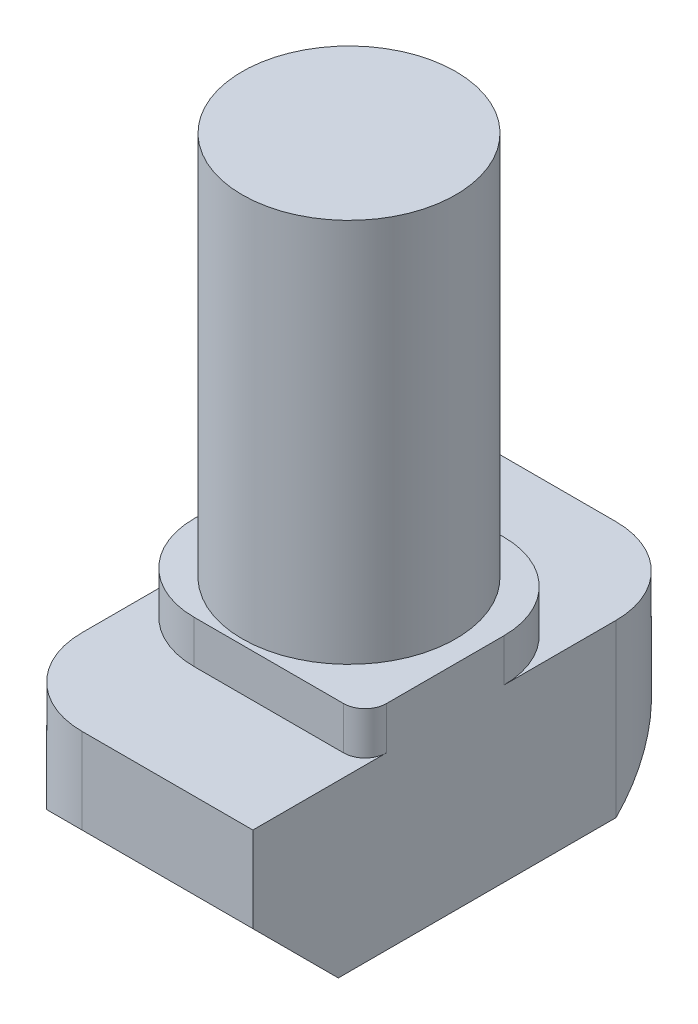
ISO-10303-21;
HEADER;
FILE_DESCRIPTION(('STEP AP214'),'2;1');
FILE_NAME('part.step','',(''),(''),'','','');
FILE_SCHEMA(('AUTOMOTIVE_DESIGN { 1 0 10303 214 1 1 1 1 }'));
ENDSEC;
DATA;
#1=APPLICATION_CONTEXT('core data for automotive mechanical design processes');
#2=APPLICATION_PROTOCOL_DEFINITION('international standard','automotive_design',2000,#1);
#3=PRODUCT_CONTEXT('',#1,'mechanical');
#4=PRODUCT('Part','Part','',(#3));
#5=PRODUCT_RELATED_PRODUCT_CATEGORY('part','',(#4));
#6=PRODUCT_DEFINITION_FORMATION('','',#4);
#7=PRODUCT_DEFINITION_CONTEXT('part definition',#1,'design');
#8=PRODUCT_DEFINITION('design','',#6,#7);
#9=PRODUCT_DEFINITION_SHAPE('','',#8);
#10=(LENGTH_UNIT() NAMED_UNIT(*) SI_UNIT(.MILLI.,.METRE.));
#11=(NAMED_UNIT(*) PLANE_ANGLE_UNIT() SI_UNIT($,.RADIAN.));
#12=(NAMED_UNIT(*) SI_UNIT($,.STERADIAN.) SOLID_ANGLE_UNIT());
#13=UNCERTAINTY_MEASURE_WITH_UNIT(LENGTH_MEASURE(1.E-05),#10,'distance_accuracy_value','');
#14=(GEOMETRIC_REPRESENTATION_CONTEXT(3) GLOBAL_UNCERTAINTY_ASSIGNED_CONTEXT((#13)) GLOBAL_UNIT_ASSIGNED_CONTEXT((#10,
#11,#12)) REPRESENTATION_CONTEXT('',''));
#15=CARTESIAN_POINT('',(0.,0.,0.));
#16=DIRECTION('',(0.,0.,1.));
#17=DIRECTION('',(1.,0.,0.));
#18=AXIS2_PLACEMENT_3D('',#15,#16,#17);
#19=CARTESIAN_POINT('',(3.,0.,2.625));
#20=DIRECTION('',(0.,-1.,0.));
#21=DIRECTION('',(0.,0.,-1.));
#22=AXIS2_PLACEMENT_3D('',#19,#20,#21);
#23=PLANE('',#22);
#24=DIRECTION('',(-1.,0.,0.));
#25=VECTOR('',#24,1.);
#26=CARTESIAN_POINT('',(3.,0.,-2.625));
#27=LINE('',#26,#25);
#28=CARTESIAN_POINT('',(1.,0.,-2.625));
#29=VERTEX_POINT('',#28);
#30=CARTESIAN_POINT('',(-2.5,0.,-2.625));
#31=VERTEX_POINT('',#30);
#32=EDGE_CURVE('E191',#29,#31,#27,.T.);
#33=ORIENTED_EDGE('',*,*,#32,.T.);
#34=CARTESIAN_POINT('',(-2.5,0.,-2.125));
#35=DIRECTION('',(0.,-1.,0.));
#36=DIRECTION('',(0.,0.,-1.));
#37=AXIS2_PLACEMENT_3D('',#34,#35,#36);
#38=CIRCLE('',#37,0.5);
#39=CARTESIAN_POINT('',(-3.,0.,-2.125));
#40=VERTEX_POINT('',#39);
#41=EDGE_CURVE('E252',#31,#40,#38,.F.);
#42=ORIENTED_EDGE('',*,*,#41,.T.);
#43=DIRECTION('',(0.,0.,1.));
#44=VECTOR('',#43,1.);
#45=CARTESIAN_POINT('',(-3.,0.,2.625));
#46=LINE('',#45,#44);
#47=CARTESIAN_POINT('',(-3.,0.,0.625000000000001));
#48=VERTEX_POINT('',#47);
#49=EDGE_CURVE('E146',#40,#48,#46,.T.);
#50=ORIENTED_EDGE('',*,*,#49,.T.);
#51=CARTESIAN_POINT('',(-1.,0.,0.625));
#52=DIRECTION('',(0.,-1.,0.));
#53=DIRECTION('',(0.,0.,-1.));
#54=AXIS2_PLACEMENT_3D('',#51,#52,#53);
#55=CIRCLE('',#54,2.);
#56=CARTESIAN_POINT('',(-1.,0.,2.625));
#57=VERTEX_POINT('',#56);
#58=EDGE_CURVE('E228',#48,#57,#55,.F.);
#59=ORIENTED_EDGE('',*,*,#58,.T.);
#60=DIRECTION('',(-1.,0.,0.));
#61=VECTOR('',#60,1.);
#62=CARTESIAN_POINT('',(3.,0.,2.625));
#63=LINE('',#62,#61);
#64=CARTESIAN_POINT('',(2.5,0.,2.625));
#65=VERTEX_POINT('',#64);
#66=EDGE_CURVE('E175',#65,#57,#63,.T.);
#67=ORIENTED_EDGE('',*,*,#66,.F.);
#68=CARTESIAN_POINT('',(2.5,0.,2.125));
#69=DIRECTION('',(0.,-1.,0.));
#70=DIRECTION('',(0.,0.,-1.));
#71=AXIS2_PLACEMENT_3D('',#68,#69,#70);
#72=CIRCLE('',#71,0.5);
#73=CARTESIAN_POINT('',(3.,0.,2.125));
#74=VERTEX_POINT('',#73);
#75=EDGE_CURVE('E250',#65,#74,#72,.F.);
#76=ORIENTED_EDGE('',*,*,#75,.T.);
#77=DIRECTION('',(0.,0.,1.));
#78=VECTOR('',#77,1.);
#79=CARTESIAN_POINT('',(3.,0.,2.625));
#80=LINE('',#79,#78);
#81=CARTESIAN_POINT('',(3.,0.,-0.624999999999999));
#82=VERTEX_POINT('',#81);
#83=EDGE_CURVE('E173',#82,#74,#80,.T.);
#84=ORIENTED_EDGE('',*,*,#83,.F.);
#85=CARTESIAN_POINT('',(1.,0.,-0.625));
#86=DIRECTION('',(0.,-1.,0.));
#87=DIRECTION('',(0.,0.,-1.));
#88=AXIS2_PLACEMENT_3D('',#85,#86,#87);
#89=CIRCLE('',#88,2.);
#90=EDGE_CURVE('E231',#82,#29,#89,.F.);
#91=ORIENTED_EDGE('',*,*,#90,.T.);
#92=EDGE_LOOP('',(#33,#42,#50,#59,#67,#76,#84,#91));
#93=FACE_BOUND('',#92,.T.);
#94=CARTESIAN_POINT('',(0.,0.,0.));
#95=DIRECTION('',(0.,-1.,0.));
#96=DIRECTION('',(0.,0.,-1.));
#97=AXIS2_PLACEMENT_3D('',#94,#95,#96);
#98=CIRCLE('',#97,2.5);
#99=CARTESIAN_POINT('',(0.,0.,-2.5));
#100=VERTEX_POINT('',#99);
#101=EDGE_CURVE('E11',#100,#100,#98,.F.);
#102=ORIENTED_EDGE('',*,*,#101,.F.);
#103=EDGE_LOOP('',(#102));
#104=FACE_BOUND('',#103,.T.);
#105=ADVANCED_FACE('F36',(#93,#104),#23,.F.);
#106=CARTESIAN_POINT('',(3.,-1.,2.625));
#107=DIRECTION('',(0.,0.,-1.));
#108=DIRECTION('',(-1.,0.,0.));
#109=AXIS2_PLACEMENT_3D('',#106,#107,#108);
#110=PLANE('',#109);
#111=DIRECTION('',(-1.,0.,0.));
#112=VECTOR('',#111,1.);
#113=CARTESIAN_POINT('',(3.,-1.,2.625));
#114=LINE('',#113,#112);
#115=CARTESIAN_POINT('',(2.5,-1.,2.625));
#116=VERTEX_POINT('',#115);
#117=CARTESIAN_POINT('',(-1.,-1.,2.625));
#118=VERTEX_POINT('',#117);
#119=EDGE_CURVE('E157',#116,#118,#114,.T.);
#120=ORIENTED_EDGE('',*,*,#119,.F.);
#121=DIRECTION('',(0.,-1.,0.));
#122=VECTOR('',#121,1.);
#123=CARTESIAN_POINT('',(2.5,-1.,2.625));
#124=LINE('',#123,#122);
#125=EDGE_CURVE('E258',#116,#65,#124,.F.);
#126=ORIENTED_EDGE('',*,*,#125,.T.);
#127=ORIENTED_EDGE('',*,*,#66,.T.);
#128=DIRECTION('',(0.,-1.,0.));
#129=VECTOR('',#128,1.);
#130=CARTESIAN_POINT('',(-1.,-1.,2.625));
#131=LINE('',#130,#129);
#132=EDGE_CURVE('E235',#57,#118,#131,.T.);
#133=ORIENTED_EDGE('',*,*,#132,.T.);
#134=EDGE_LOOP('',(#120,#126,#127,#133));
#135=FACE_BOUND('',#134,.T.);
#136=ADVANCED_FACE('F293',(#135),#110,.F.);
#137=CARTESIAN_POINT('',(3.,-1.,5.25));
#138=DIRECTION('',(0.,-1.,0.));
#139=DIRECTION('',(0.,0.,-1.));
#140=AXIS2_PLACEMENT_3D('',#137,#138,#139);
#141=PLANE('',#140);
#142=DIRECTION('',(0.,0.,1.));
#143=VECTOR('',#142,1.);
#144=CARTESIAN_POINT('',(-3.,-1.,5.25));
#145=LINE('',#144,#143);
#146=CARTESIAN_POINT('',(-3.,-1.,0.625));
#147=VERTEX_POINT('',#146);
#148=CARTESIAN_POINT('',(-3.,-1.,3.25));
#149=VERTEX_POINT('',#148);
#150=EDGE_CURVE('E176',#147,#149,#145,.T.);
#151=ORIENTED_EDGE('',*,*,#150,.T.);
#152=CARTESIAN_POINT('',(-1.,-1.,3.25));
#153=DIRECTION('',(0.,-1.,0.));
#154=DIRECTION('',(0.,0.,-1.));
#155=AXIS2_PLACEMENT_3D('',#152,#153,#154);
#156=CIRCLE('',#155,2.);
#157=CARTESIAN_POINT('',(-1.,-1.,5.25));
#158=VERTEX_POINT('',#157);
#159=EDGE_CURVE('E153',#149,#158,#156,.F.);
#160=ORIENTED_EDGE('',*,*,#159,.T.);
#161=DIRECTION('',(-1.,0.,0.));
#162=VECTOR('',#161,1.);
#163=CARTESIAN_POINT('',(3.,-1.,5.25));
#164=LINE('',#163,#162);
#165=CARTESIAN_POINT('',(3.,-1.,5.25));
#166=VERTEX_POINT('',#165);
#167=EDGE_CURVE('E149',#166,#158,#164,.T.);
#168=ORIENTED_EDGE('',*,*,#167,.F.);
#169=DIRECTION('',(0.,0.,1.));
#170=VECTOR('',#169,1.);
#171=CARTESIAN_POINT('',(3.,-1.,5.25));
#172=LINE('',#171,#170);
#173=CARTESIAN_POINT('',(3.,-1.,2.125));
#174=VERTEX_POINT('',#173);
#175=EDGE_CURVE('E55',#174,#166,#172,.T.);
#176=ORIENTED_EDGE('',*,*,#175,.F.);
#177=CARTESIAN_POINT('',(2.5,-1.,2.125));
#178=DIRECTION('',(0.,-1.,0.));
#179=DIRECTION('',(0.,0.,-1.));
#180=AXIS2_PLACEMENT_3D('',#177,#178,#179);
#181=CIRCLE('',#180,0.5);
#182=EDGE_CURVE('E44',#174,#116,#181,.T.);
#183=ORIENTED_EDGE('',*,*,#182,.T.);
#184=ORIENTED_EDGE('',*,*,#119,.T.);
#185=CARTESIAN_POINT('',(-1.,-1.,0.625));
#186=DIRECTION('',(0.,-1.,0.));
#187=DIRECTION('',(0.,0.,-1.));
#188=AXIS2_PLACEMENT_3D('',#185,#186,#187);
#189=CIRCLE('',#188,2.);
#190=EDGE_CURVE('E244',#118,#147,#189,.T.);
#191=ORIENTED_EDGE('',*,*,#190,.T.);
#192=EDGE_LOOP('',(#151,#160,#168,#176,#183,#184,#191));
#193=FACE_BOUND('',#192,.T.);
#194=ADVANCED_FACE('F151',(#193),#141,.F.);
#195=CARTESIAN_POINT('',(3.,-3.,5.25));
#196=DIRECTION('',(0.,0.,-1.));
#197=DIRECTION('',(-1.,0.,0.));
#198=AXIS2_PLACEMENT_3D('',#195,#196,#197);
#199=PLANE('',#198);
#200=ORIENTED_EDGE('',*,*,#167,.T.);
#201=DIRECTION('',(0.,-1.,0.));
#202=VECTOR('',#201,1.);
#203=CARTESIAN_POINT('',(-1.,-3.,5.25));
#204=LINE('',#203,#202);
#205=CARTESIAN_POINT('',(-1.,-3.,5.25));
#206=VERTEX_POINT('',#205);
#207=EDGE_CURVE('E218',#158,#206,#204,.T.);
#208=ORIENTED_EDGE('',*,*,#207,.T.);
#209=DIRECTION('',(-1.,0.,0.));
#210=VECTOR('',#209,1.);
#211=CARTESIAN_POINT('',(3.,-3.,5.25));
#212=LINE('',#211,#210);
#213=CARTESIAN_POINT('',(3.,-3.,5.25));
#214=VERTEX_POINT('',#213);
#215=EDGE_CURVE('E158',#214,#206,#212,.T.);
#216=ORIENTED_EDGE('',*,*,#215,.F.);
#217=DIRECTION('',(0.,-1.,0.));
#218=VECTOR('',#217,1.);
#219=CARTESIAN_POINT('',(3.,-3.,5.25));
#220=LINE('',#219,#218);
#221=EDGE_CURVE('E142',#166,#214,#220,.T.);
#222=ORIENTED_EDGE('',*,*,#221,.F.);
#223=EDGE_LOOP('',(#200,#208,#216,#222));
#224=FACE_BOUND('',#223,.T.);
#225=ADVANCED_FACE('F160',(#224),#199,.F.);
#226=CARTESIAN_POINT('',(3.,-5.,3.25));
#227=DIRECTION('',(0.,0.707106781186546,-0.707106781186549));
#228=DIRECTION('',(0.,0.707106781186549,0.707106781186546));
#229=AXIS2_PLACEMENT_3D('',#226,#227,#228);
#230=PLANE('',#229);
#231=ORIENTED_EDGE('',*,*,#215,.T.);
#232=CARTESIAN_POINT('',(-1.,-5.00000000000001,3.25));
#233=DIRECTION('',(0.,0.707106781186546,-0.707106781186549));
#234=DIRECTION('',(0.,0.707106781186549,0.707106781186546));
#235=AXIS2_PLACEMENT_3D('',#232,#233,#234);
#236=ELLIPSE('',#235,2.82842712474619,2.);
#237=CARTESIAN_POINT('',(-3.,-5.,3.25));
#238=VERTEX_POINT('',#237);
#239=EDGE_CURVE('E220',#206,#238,#236,.F.);
#240=ORIENTED_EDGE('',*,*,#239,.T.);
#241=DIRECTION('',(-1.,0.,0.));
#242=VECTOR('',#241,1.);
#243=CARTESIAN_POINT('',(3.,-5.,3.25));
#244=LINE('',#243,#242);
#245=CARTESIAN_POINT('',(3.,-5.,3.25));
#246=VERTEX_POINT('',#245);
#247=EDGE_CURVE('E204',#246,#238,#244,.T.);
#248=ORIENTED_EDGE('',*,*,#247,.F.);
#249=DIRECTION('',(0.,-0.707106781186549,-0.707106781186546));
#250=VECTOR('',#249,1.);
#251=CARTESIAN_POINT('',(3.,-5.,3.25));
#252=LINE('',#251,#250);
#253=EDGE_CURVE('E163',#214,#246,#252,.T.);
#254=ORIENTED_EDGE('',*,*,#253,.F.);
#255=EDGE_LOOP('',(#231,#240,#248,#254));
#256=FACE_BOUND('',#255,.T.);
#257=ADVANCED_FACE('F298',(#256),#230,.F.);
#258=CARTESIAN_POINT('',(3.,-5.,-3.24999999999999));
#259=DIRECTION('',(0.,1.,0.));
#260=DIRECTION('',(0.,0.,1.));
#261=AXIS2_PLACEMENT_3D('',#258,#259,#260);
#262=PLANE('',#261);
#263=DIRECTION('',(0.,0.,-1.));
#264=VECTOR('',#263,1.);
#265=CARTESIAN_POINT('',(-3.,-5.,-3.24999999999999));
#266=LINE('',#265,#264);
#267=CARTESIAN_POINT('',(-3.,-5.,-3.24999999999999));
#268=VERTEX_POINT('',#267);
#269=EDGE_CURVE('E178',#238,#268,#266,.T.);
#270=ORIENTED_EDGE('',*,*,#269,.T.);
#271=DIRECTION('',(-1.,0.,0.));
#272=VECTOR('',#271,1.);
#273=CARTESIAN_POINT('',(3.,-5.,-3.24999999999999));
#274=LINE('',#273,#272);
#275=CARTESIAN_POINT('',(3.,-5.,-3.24999999999999));
#276=VERTEX_POINT('',#275);
#277=EDGE_CURVE('E201',#276,#268,#274,.T.);
#278=ORIENTED_EDGE('',*,*,#277,.F.);
#279=DIRECTION('',(0.,0.,-1.));
#280=VECTOR('',#279,1.);
#281=CARTESIAN_POINT('',(3.,-5.,-3.24999999999999));
#282=LINE('',#281,#280);
#283=EDGE_CURVE('E165',#246,#276,#282,.T.);
#284=ORIENTED_EDGE('',*,*,#283,.F.);
#285=ORIENTED_EDGE('',*,*,#247,.T.);
#286=EDGE_LOOP('',(#270,#278,#284,#285));
#287=FACE_BOUND('',#286,.T.);
#288=ADVANCED_FACE('F304',(#287),#262,.F.);
#289=CARTESIAN_POINT('',(3.,-3.,-5.25));
#290=DIRECTION('',(0.,0.707106781186548,0.707106781186547));
#291=DIRECTION('',(0.,-0.707106781186547,0.707106781186548));
#292=AXIS2_PLACEMENT_3D('',#289,#290,#291);
#293=PLANE('',#292);
#294=DIRECTION('',(-1.,0.,0.));
#295=VECTOR('',#294,1.);
#296=CARTESIAN_POINT('',(3.,-3.,-5.25));
#297=LINE('',#296,#295);
#298=CARTESIAN_POINT('',(1.,-3.,-5.25));
#299=VERTEX_POINT('',#298);
#300=CARTESIAN_POINT('',(-3.,-3.,-5.25));
#301=VERTEX_POINT('',#300);
#302=EDGE_CURVE('E199',#299,#301,#297,.T.);
#303=ORIENTED_EDGE('',*,*,#302,.F.);
#304=CARTESIAN_POINT('',(1.,-4.99999999999999,-3.25));
#305=DIRECTION('',(0.,0.707106781186548,0.707106781186547));
#306=DIRECTION('',(0.,0.707106781186547,-0.707106781186548));
#307=AXIS2_PLACEMENT_3D('',#304,#305,#306);
#308=ELLIPSE('',#307,2.82842712474619,2.);
#309=EDGE_CURVE('E216',#299,#276,#308,.F.);
#310=ORIENTED_EDGE('',*,*,#309,.T.);
#311=ORIENTED_EDGE('',*,*,#277,.T.);
#312=DIRECTION('',(0.,0.707106781186547,-0.707106781186548));
#313=VECTOR('',#312,1.);
#314=CARTESIAN_POINT('',(-3.,-3.,-5.25));
#315=LINE('',#314,#313);
#316=EDGE_CURVE('E181',#268,#301,#315,.T.);
#317=ORIENTED_EDGE('',*,*,#316,.T.);
#318=EDGE_LOOP('',(#303,#310,#311,#317));
#319=FACE_BOUND('',#318,.T.);
#320=ADVANCED_FACE('F317',(#319),#293,.F.);
#321=CARTESIAN_POINT('',(3.,-1.,-5.25));
#322=DIRECTION('',(0.,0.,1.));
#323=DIRECTION('',(1.,0.,0.));
#324=AXIS2_PLACEMENT_3D('',#321,#322,#323);
#325=PLANE('',#324);
#326=DIRECTION('',(-1.,0.,0.));
#327=VECTOR('',#326,1.);
#328=CARTESIAN_POINT('',(3.,-1.,-5.25));
#329=LINE('',#328,#327);
#330=CARTESIAN_POINT('',(1.,-1.,-5.25));
#331=VERTEX_POINT('',#330);
#332=CARTESIAN_POINT('',(-3.,-1.,-5.25));
#333=VERTEX_POINT('',#332);
#334=EDGE_CURVE('E197',#331,#333,#329,.T.);
#335=ORIENTED_EDGE('',*,*,#334,.F.);
#336=DIRECTION('',(0.,1.,0.));
#337=VECTOR('',#336,1.);
#338=CARTESIAN_POINT('',(1.,-1.,-5.25));
#339=LINE('',#338,#337);
#340=EDGE_CURVE('E214',#331,#299,#339,.F.);
#341=ORIENTED_EDGE('',*,*,#340,.T.);
#342=ORIENTED_EDGE('',*,*,#302,.T.);
#343=DIRECTION('',(0.,1.,0.));
#344=VECTOR('',#343,1.);
#345=CARTESIAN_POINT('',(-3.,-1.,-5.25));
#346=LINE('',#345,#344);
#347=EDGE_CURVE('E184',#301,#333,#346,.T.);
#348=ORIENTED_EDGE('',*,*,#347,.T.);
#349=EDGE_LOOP('',(#335,#341,#342,#348));
#350=FACE_BOUND('',#349,.T.);
#351=ADVANCED_FACE('F314',(#350),#325,.F.);
#352=CARTESIAN_POINT('',(3.,-1.,-2.625));
#353=DIRECTION('',(0.,-1.,0.));
#354=DIRECTION('',(0.,0.,-1.));
#355=AXIS2_PLACEMENT_3D('',#352,#353,#354);
#356=PLANE('',#355);
#357=DIRECTION('',(0.,0.,1.));
#358=VECTOR('',#357,1.);
#359=CARTESIAN_POINT('',(3.,-1.,-2.625));
#360=LINE('',#359,#358);
#361=CARTESIAN_POINT('',(3.,-1.,-3.25));
#362=VERTEX_POINT('',#361);
#363=CARTESIAN_POINT('',(3.,-1.,-0.625));
#364=VERTEX_POINT('',#363);
#365=EDGE_CURVE('E171',#362,#364,#360,.T.);
#366=ORIENTED_EDGE('',*,*,#365,.F.);
#367=CARTESIAN_POINT('',(1.,-1.,-3.25));
#368=DIRECTION('',(0.,-1.,0.));
#369=DIRECTION('',(0.,0.,-1.));
#370=AXIS2_PLACEMENT_3D('',#367,#368,#369);
#371=CIRCLE('',#370,2.);
#372=EDGE_CURVE('E212',#362,#331,#371,.F.);
#373=ORIENTED_EDGE('',*,*,#372,.T.);
#374=ORIENTED_EDGE('',*,*,#334,.T.);
#375=DIRECTION('',(0.,0.,1.));
#376=VECTOR('',#375,1.);
#377=CARTESIAN_POINT('',(-3.,-1.,-2.625));
#378=LINE('',#377,#376);
#379=CARTESIAN_POINT('',(-3.,-1.,-2.125));
#380=VERTEX_POINT('',#379);
#381=EDGE_CURVE('E187',#333,#380,#378,.T.);
#382=ORIENTED_EDGE('',*,*,#381,.T.);
#383=CARTESIAN_POINT('',(-2.5,-1.,-2.125));
#384=DIRECTION('',(0.,-1.,0.));
#385=DIRECTION('',(0.,0.,-1.));
#386=AXIS2_PLACEMENT_3D('',#383,#384,#385);
#387=CIRCLE('',#386,0.5);
#388=CARTESIAN_POINT('',(-2.5,-1.,-2.625));
#389=VERTEX_POINT('',#388);
#390=EDGE_CURVE('E260',#380,#389,#387,.T.);
#391=ORIENTED_EDGE('',*,*,#390,.T.);
#392=DIRECTION('',(-1.,0.,0.));
#393=VECTOR('',#392,1.);
#394=CARTESIAN_POINT('',(3.,-1.,-2.625));
#395=LINE('',#394,#393);
#396=CARTESIAN_POINT('',(1.,-1.,-2.625));
#397=VERTEX_POINT('',#396);
#398=EDGE_CURVE('E194',#397,#389,#395,.T.);
#399=ORIENTED_EDGE('',*,*,#398,.F.);
#400=CARTESIAN_POINT('',(1.,-1.,-0.625));
#401=DIRECTION('',(0.,-1.,0.));
#402=DIRECTION('',(0.,0.,-1.));
#403=AXIS2_PLACEMENT_3D('',#400,#401,#402);
#404=CIRCLE('',#403,2.);
#405=EDGE_CURVE('E241',#397,#364,#404,.T.);
#406=ORIENTED_EDGE('',*,*,#405,.T.);
#407=EDGE_LOOP('',(#366,#373,#374,#382,#391,#399,#406));
#408=FACE_BOUND('',#407,.T.);
#409=ADVANCED_FACE('F265',(#408),#356,.F.);
#410=CARTESIAN_POINT('',(3.,0.,-2.625));
#411=DIRECTION('',(0.,0.,1.));
#412=DIRECTION('',(1.,0.,0.));
#413=AXIS2_PLACEMENT_3D('',#410,#411,#412);
#414=PLANE('',#413);
#415=ORIENTED_EDGE('',*,*,#398,.T.);
#416=DIRECTION('',(0.,1.,0.));
#417=VECTOR('',#416,1.);
#418=CARTESIAN_POINT('',(-2.5,0.,-2.625));
#419=LINE('',#418,#417);
#420=EDGE_CURVE('E247',#389,#31,#419,.T.);
#421=ORIENTED_EDGE('',*,*,#420,.T.);
#422=ORIENTED_EDGE('',*,*,#32,.F.);
#423=DIRECTION('',(0.,1.,0.));
#424=VECTOR('',#423,1.);
#425=CARTESIAN_POINT('',(1.,0.,-2.625));
#426=LINE('',#425,#424);
#427=EDGE_CURVE('E233',#29,#397,#426,.F.);
#428=ORIENTED_EDGE('',*,*,#427,.T.);
#429=EDGE_LOOP('',(#415,#421,#422,#428));
#430=FACE_BOUND('',#429,.T.);
#431=ADVANCED_FACE('F272',(#430),#414,.F.);
#432=CARTESIAN_POINT('',(3.,0.,0.));
#433=DIRECTION('',(-1.,0.,0.));
#434=DIRECTION('',(0.,0.,1.));
#435=AXIS2_PLACEMENT_3D('',#432,#433,#434);
#436=PLANE('',#435);
#437=ORIENTED_EDGE('',*,*,#83,.T.);
#438=DIRECTION('',(0.,-1.,0.));
#439=VECTOR('',#438,1.);
#440=CARTESIAN_POINT('',(3.,0.,2.125));
#441=LINE('',#440,#439);
#442=EDGE_CURVE('E145',#74,#174,#441,.T.);
#443=ORIENTED_EDGE('',*,*,#442,.T.);
#444=ORIENTED_EDGE('',*,*,#175,.T.);
#445=ORIENTED_EDGE('',*,*,#221,.T.);
#446=ORIENTED_EDGE('',*,*,#253,.T.);
#447=ORIENTED_EDGE('',*,*,#283,.T.);
#448=DIRECTION('',(0.,1.,0.));
#449=VECTOR('',#448,1.);
#450=CARTESIAN_POINT('',(3.,0.,-3.25));
#451=LINE('',#450,#449);
#452=EDGE_CURVE('E209',#276,#362,#451,.T.);
#453=ORIENTED_EDGE('',*,*,#452,.T.);
#454=ORIENTED_EDGE('',*,*,#365,.T.);
#455=DIRECTION('',(0.,1.,0.));
#456=VECTOR('',#455,1.);
#457=CARTESIAN_POINT('',(3.,0.,-0.625));
#458=LINE('',#457,#456);
#459=EDGE_CURVE('E225',#364,#82,#458,.T.);
#460=ORIENTED_EDGE('',*,*,#459,.T.);
#461=EDGE_LOOP('',(#437,#443,#444,#445,#446,#447,#453,#454,#460));
#462=FACE_BOUND('',#461,.T.);
#463=ADVANCED_FACE('F140',(#462),#436,.F.);
#464=CARTESIAN_POINT('',(-3.,0.,0.));
#465=DIRECTION('',(-1.,0.,0.));
#466=DIRECTION('',(0.,0.,1.));
#467=AXIS2_PLACEMENT_3D('',#464,#465,#466);
#468=PLANE('',#467);
#469=ORIENTED_EDGE('',*,*,#49,.F.);
#470=DIRECTION('',(0.,1.,0.));
#471=VECTOR('',#470,1.);
#472=CARTESIAN_POINT('',(-3.,-1.,-2.125));
#473=LINE('',#472,#471);
#474=EDGE_CURVE('E254',#40,#380,#473,.F.);
#475=ORIENTED_EDGE('',*,*,#474,.T.);
#476=ORIENTED_EDGE('',*,*,#381,.F.);
#477=ORIENTED_EDGE('',*,*,#347,.F.);
#478=ORIENTED_EDGE('',*,*,#316,.F.);
#479=ORIENTED_EDGE('',*,*,#269,.F.);
#480=DIRECTION('',(0.,-1.,0.));
#481=VECTOR('',#480,1.);
#482=CARTESIAN_POINT('',(-3.,-1.,3.25));
#483=LINE('',#482,#481);
#484=EDGE_CURVE('E222',#238,#149,#483,.F.);
#485=ORIENTED_EDGE('',*,*,#484,.T.);
#486=ORIENTED_EDGE('',*,*,#150,.F.);
#487=DIRECTION('',(0.,-1.,0.));
#488=VECTOR('',#487,1.);
#489=CARTESIAN_POINT('',(-3.,0.,0.625));
#490=LINE('',#489,#488);
#491=EDGE_CURVE('E238',#147,#48,#490,.F.);
#492=ORIENTED_EDGE('',*,*,#491,.T.);
#493=EDGE_LOOP('',(#469,#475,#476,#477,#478,#479,#485,#486,#492));
#494=FACE_BOUND('',#493,.T.);
#495=ADVANCED_FACE('F280',(#494),#468,.T.);
#496=CARTESIAN_POINT('',(1.,0.,-3.25));
#497=DIRECTION('',(0.,1.,0.));
#498=DIRECTION('',(0.,0.,1.));
#499=AXIS2_PLACEMENT_3D('',#496,#497,#498);
#500=CYLINDRICAL_SURFACE('',#499,2.);
#501=ORIENTED_EDGE('',*,*,#309,.F.);
#502=ORIENTED_EDGE('',*,*,#340,.F.);
#503=ORIENTED_EDGE('',*,*,#372,.F.);
#504=ORIENTED_EDGE('',*,*,#452,.F.);
#505=EDGE_LOOP('',(#501,#502,#503,#504));
#506=FACE_BOUND('',#505,.T.);
#507=ADVANCED_FACE('F310',(#506),#500,.T.);
#508=CARTESIAN_POINT('',(-1.,-3.,3.25));
#509=DIRECTION('',(0.,1.,0.));
#510=DIRECTION('',(0.,0.,1.));
#511=AXIS2_PLACEMENT_3D('',#508,#509,#510);
#512=CYLINDRICAL_SURFACE('',#511,2.);
#513=ORIENTED_EDGE('',*,*,#159,.F.);
#514=ORIENTED_EDGE('',*,*,#484,.F.);
#515=ORIENTED_EDGE('',*,*,#239,.F.);
#516=ORIENTED_EDGE('',*,*,#207,.F.);
#517=EDGE_LOOP('',(#513,#514,#515,#516));
#518=FACE_BOUND('',#517,.T.);
#519=ADVANCED_FACE('F296',(#518),#512,.T.);
#520=CARTESIAN_POINT('',(1.,0.,-0.625));
#521=DIRECTION('',(0.,1.,0.));
#522=DIRECTION('',(0.,0.,1.));
#523=AXIS2_PLACEMENT_3D('',#520,#521,#522);
#524=CYLINDRICAL_SURFACE('',#523,2.);
#525=ORIENTED_EDGE('',*,*,#405,.F.);
#526=ORIENTED_EDGE('',*,*,#427,.F.);
#527=ORIENTED_EDGE('',*,*,#90,.F.);
#528=ORIENTED_EDGE('',*,*,#459,.F.);
#529=EDGE_LOOP('',(#525,#526,#527,#528));
#530=FACE_BOUND('',#529,.T.);
#531=ADVANCED_FACE('F370',(#530),#524,.T.);
#532=CARTESIAN_POINT('',(-1.,-1.,0.625));
#533=DIRECTION('',(0.,1.,0.));
#534=DIRECTION('',(0.,0.,1.));
#535=AXIS2_PLACEMENT_3D('',#532,#533,#534);
#536=CYLINDRICAL_SURFACE('',#535,2.);
#537=ORIENTED_EDGE('',*,*,#58,.F.);
#538=ORIENTED_EDGE('',*,*,#491,.F.);
#539=ORIENTED_EDGE('',*,*,#190,.F.);
#540=ORIENTED_EDGE('',*,*,#132,.F.);
#541=EDGE_LOOP('',(#537,#538,#539,#540));
#542=FACE_BOUND('',#541,.T.);
#543=ADVANCED_FACE('F286',(#542),#536,.T.);
#544=CARTESIAN_POINT('',(-2.5,0.,-2.125));
#545=DIRECTION('',(0.,-1.,0.));
#546=DIRECTION('',(0.,0.,-1.));
#547=AXIS2_PLACEMENT_3D('',#544,#545,#546);
#548=CYLINDRICAL_SURFACE('',#547,0.5);
#549=ORIENTED_EDGE('',*,*,#390,.F.);
#550=ORIENTED_EDGE('',*,*,#474,.F.);
#551=ORIENTED_EDGE('',*,*,#41,.F.);
#552=ORIENTED_EDGE('',*,*,#420,.F.);
#553=EDGE_LOOP('',(#549,#550,#551,#552));
#554=FACE_BOUND('',#553,.T.);
#555=ADVANCED_FACE('F275',(#554),#548,.T.);
#556=CARTESIAN_POINT('',(2.5,0.,2.125));
#557=DIRECTION('',(0.,-1.,0.));
#558=DIRECTION('',(0.,0.,-1.));
#559=AXIS2_PLACEMENT_3D('',#556,#557,#558);
#560=CYLINDRICAL_SURFACE('',#559,0.5);
#561=ORIENTED_EDGE('',*,*,#75,.F.);
#562=ORIENTED_EDGE('',*,*,#125,.F.);
#563=ORIENTED_EDGE('',*,*,#182,.F.);
#564=ORIENTED_EDGE('',*,*,#442,.F.);
#565=EDGE_LOOP('',(#561,#562,#563,#564));
#566=FACE_BOUND('',#565,.T.);
#567=ADVANCED_FACE('F38',(#566),#560,.T.);
#568=CARTESIAN_POINT('',(0.,55.,0.));
#569=DIRECTION('',(0.,1.,0.));
#570=DIRECTION('',(0.,0.,1.));
#571=AXIS2_PLACEMENT_3D('',#568,#569,#570);
#572=CYLINDRICAL_SURFACE('',#571,2.5);
#573=CARTESIAN_POINT('',(0.,9.,0.));
#574=DIRECTION('',(0.,1.,0.));
#575=DIRECTION('',(0.,0.,1.));
#576=AXIS2_PLACEMENT_3D('',#573,#574,#575);
#577=CIRCLE('',#576,2.5);
#578=CARTESIAN_POINT('',(0.,9.,2.5));
#579=VERTEX_POINT('',#578);
#580=EDGE_CURVE('E179',#579,#579,#577,.T.);
#581=ORIENTED_EDGE('',*,*,#580,.F.);
#582=EDGE_LOOP('',(#581));
#583=FACE_BOUND('',#582,.T.);
#584=ORIENTED_EDGE('',*,*,#101,.T.);
#585=EDGE_LOOP('',(#584));
#586=FACE_BOUND('',#585,.T.);
#587=ADVANCED_FACE('F395',(#583,#586),#572,.T.);
#588=CARTESIAN_POINT('',(2.5,9.,0.));
#589=DIRECTION('',(0.,-1.,0.));
#590=DIRECTION('',(0.,0.,-1.));
#591=AXIS2_PLACEMENT_3D('',#588,#589,#590);
#592=PLANE('',#591);
#593=ORIENTED_EDGE('',*,*,#580,.T.);
#594=EDGE_LOOP('',(#593));
#595=FACE_BOUND('',#594,.T.);
#596=ADVANCED_FACE('F401',(#595),#592,.F.);
#597=CLOSED_SHELL('',(#105,#136,#194,#225,#257,#288,#320,#351,#409,#431,#463,#495,#507,#519,
#531,#543,#555,#567,#587,#596));
#598=MANIFOLD_SOLID_BREP('B2',#597);
#599=ADVANCED_BREP_SHAPE_REPRESENTATION('',(#18,#598),#14);
#600=SHAPE_DEFINITION_REPRESENTATION(#9,#599);
ENDSEC;
END-ISO-10303-21;
